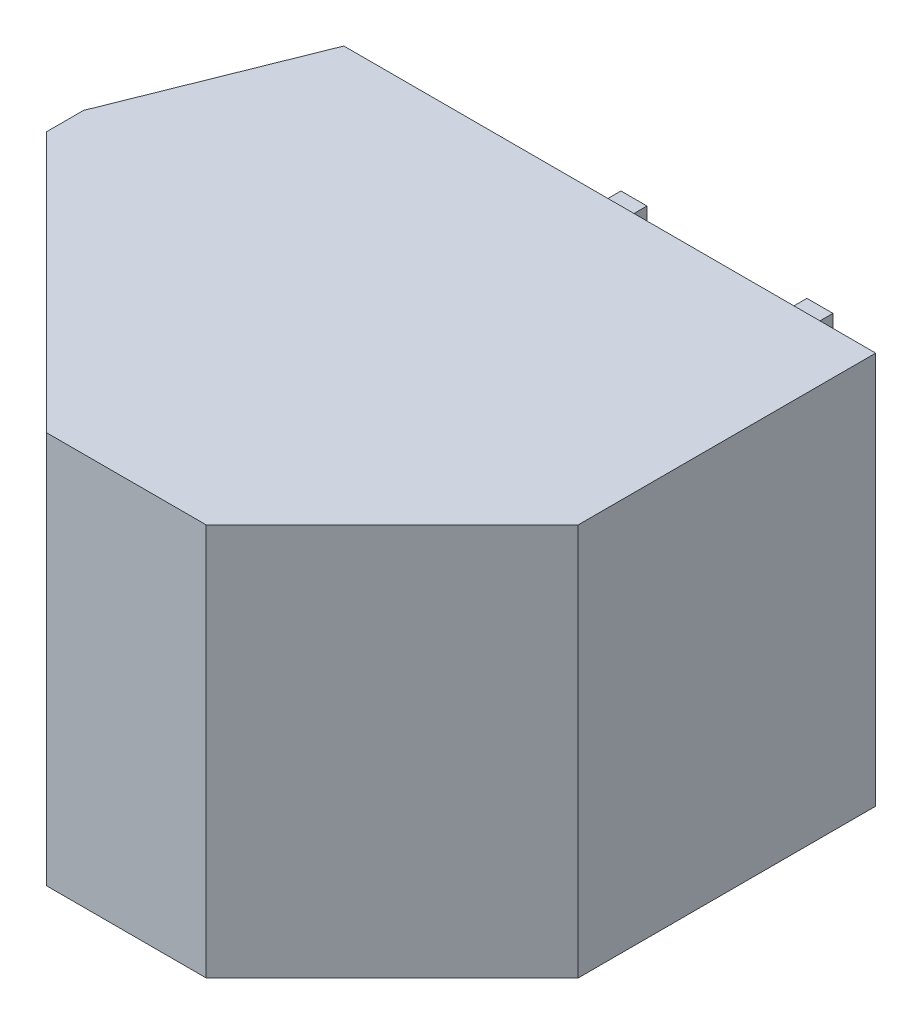
ISO-10303-21;
HEADER;
FILE_DESCRIPTION(('STEP AP214'),'2;1');
FILE_NAME('part.step','',(''),(''),'','','');
FILE_SCHEMA(('AUTOMOTIVE_DESIGN { 1 0 10303 214 1 1 1 1 }'));
ENDSEC;
DATA;
#1=APPLICATION_CONTEXT('core data for automotive mechanical design processes');
#2=APPLICATION_PROTOCOL_DEFINITION('international standard','automotive_design',2000,#1);
#3=PRODUCT_CONTEXT('',#1,'mechanical');
#4=PRODUCT('Part','Part','',(#3));
#5=PRODUCT_RELATED_PRODUCT_CATEGORY('part','',(#4));
#6=PRODUCT_DEFINITION_FORMATION('','',#4);
#7=PRODUCT_DEFINITION_CONTEXT('part definition',#1,'design');
#8=PRODUCT_DEFINITION('design','',#6,#7);
#9=PRODUCT_DEFINITION_SHAPE('','',#8);
#10=(LENGTH_UNIT() NAMED_UNIT(*) SI_UNIT(.MILLI.,.METRE.));
#11=(NAMED_UNIT(*) PLANE_ANGLE_UNIT() SI_UNIT($,.RADIAN.));
#12=(NAMED_UNIT(*) SI_UNIT($,.STERADIAN.) SOLID_ANGLE_UNIT());
#13=UNCERTAINTY_MEASURE_WITH_UNIT(LENGTH_MEASURE(1.E-05),#10,'distance_accuracy_value','');
#14=(GEOMETRIC_REPRESENTATION_CONTEXT(3) GLOBAL_UNCERTAINTY_ASSIGNED_CONTEXT((#13)) GLOBAL_UNIT_ASSIGNED_CONTEXT((#10,
#11,#12)) REPRESENTATION_CONTEXT('',''));
#15=CARTESIAN_POINT('',(0.,0.,0.));
#16=DIRECTION('',(0.,0.,1.));
#17=DIRECTION('',(1.,0.,0.));
#18=AXIS2_PLACEMENT_3D('',#15,#16,#17);
#19=CARTESIAN_POINT('',(0.,0.,0.));
#20=DIRECTION('',(0.,0.,-1.));
#21=DIRECTION('',(-1.,0.,0.));
#22=AXIS2_PLACEMENT_3D('',#19,#20,#21);
#23=PLANE('',#22);
#24=DIRECTION('',(1.,0.,0.));
#25=VECTOR('',#24,1.);
#26=CARTESIAN_POINT('',(0.,0.,0.));
#27=LINE('',#26,#25);
#28=CARTESIAN_POINT('',(2.,0.,0.));
#29=VERTEX_POINT('',#28);
#30=CARTESIAN_POINT('',(16.3,0.,0.));
#31=VERTEX_POINT('',#30);
#32=EDGE_CURVE('E304',#29,#31,#27,.T.);
#33=ORIENTED_EDGE('',*,*,#32,.F.);
#34=DIRECTION('',(0.,1.,0.));
#35=VECTOR('',#34,1.);
#36=CARTESIAN_POINT('',(2.,10.55,0.));
#37=LINE('',#36,#35);
#38=CARTESIAN_POINT('',(2.,10.55,0.));
#39=VERTEX_POINT('',#38);
#40=EDGE_CURVE('E341',#29,#39,#37,.T.);
#41=ORIENTED_EDGE('',*,*,#40,.T.);
#42=DIRECTION('',(-1.,0.,0.));
#43=VECTOR('',#42,1.);
#44=CARTESIAN_POINT('',(0.,10.55,0.));
#45=LINE('',#44,#43);
#46=CARTESIAN_POINT('',(16.3,10.55,0.));
#47=VERTEX_POINT('',#46);
#48=EDGE_CURVE('E308',#47,#39,#45,.T.);
#49=ORIENTED_EDGE('',*,*,#48,.F.);
#50=DIRECTION('',(0.,1.,0.));
#51=VECTOR('',#50,1.);
#52=CARTESIAN_POINT('',(16.3,0.,0.));
#53=LINE('',#52,#51);
#54=EDGE_CURVE('E313',#31,#47,#53,.T.);
#55=ORIENTED_EDGE('',*,*,#54,.F.);
#56=EDGE_LOOP('',(#33,#41,#49,#55));
#57=FACE_BOUND('',#56,.T.);
#58=DIRECTION('',(-1.,0.,0.));
#59=VECTOR('',#58,1.);
#60=CARTESIAN_POINT('',(5.95,1.7,0.));
#61=LINE('',#60,#59);
#62=CARTESIAN_POINT('',(6.65,1.7,0.));
#63=VERTEX_POINT('',#62);
#64=CARTESIAN_POINT('',(5.95,1.7,0.));
#65=VERTEX_POINT('',#64);
#66=EDGE_CURVE('E289',#63,#65,#61,.T.);
#67=ORIENTED_EDGE('',*,*,#66,.F.);
#68=DIRECTION('',(0.,-1.,0.));
#69=VECTOR('',#68,1.);
#70=CARTESIAN_POINT('',(6.65,1.7,0.));
#71=LINE('',#70,#69);
#72=CARTESIAN_POINT('',(6.65,2.4,0.));
#73=VERTEX_POINT('',#72);
#74=EDGE_CURVE('E275',#73,#63,#71,.T.);
#75=ORIENTED_EDGE('',*,*,#74,.F.);
#76=DIRECTION('',(1.,0.,0.));
#77=VECTOR('',#76,1.);
#78=CARTESIAN_POINT('',(5.95,2.4,0.));
#79=LINE('',#78,#77);
#80=CARTESIAN_POINT('',(5.95,2.4,0.));
#81=VERTEX_POINT('',#80);
#82=EDGE_CURVE('E280',#81,#73,#79,.T.);
#83=ORIENTED_EDGE('',*,*,#82,.F.);
#84=DIRECTION('',(0.,1.,0.));
#85=VECTOR('',#84,1.);
#86=CARTESIAN_POINT('',(5.95,1.7,0.));
#87=LINE('',#86,#85);
#88=EDGE_CURVE('E291',#65,#81,#87,.T.);
#89=ORIENTED_EDGE('',*,*,#88,.F.);
#90=EDGE_LOOP('',(#67,#75,#83,#89));
#91=FACE_BOUND('',#90,.T.);
#92=DIRECTION('',(-1.,0.,0.));
#93=VECTOR('',#92,1.);
#94=CARTESIAN_POINT('',(5.95,6.7,0.));
#95=LINE('',#94,#93);
#96=CARTESIAN_POINT('',(6.65,6.7,0.));
#97=VERTEX_POINT('',#96);
#98=CARTESIAN_POINT('',(5.95,6.7,0.));
#99=VERTEX_POINT('',#98);
#100=EDGE_CURVE('E260',#97,#99,#95,.T.);
#101=ORIENTED_EDGE('',*,*,#100,.F.);
#102=DIRECTION('',(0.,-1.,0.));
#103=VECTOR('',#102,1.);
#104=CARTESIAN_POINT('',(6.65,6.7,0.));
#105=LINE('',#104,#103);
#106=CARTESIAN_POINT('',(6.65,7.4,0.));
#107=VERTEX_POINT('',#106);
#108=EDGE_CURVE('E246',#107,#97,#105,.T.);
#109=ORIENTED_EDGE('',*,*,#108,.F.);
#110=DIRECTION('',(1.,0.,0.));
#111=VECTOR('',#110,1.);
#112=CARTESIAN_POINT('',(5.95,7.4,0.));
#113=LINE('',#112,#111);
#114=CARTESIAN_POINT('',(5.95,7.4,0.));
#115=VERTEX_POINT('',#114);
#116=EDGE_CURVE('E251',#115,#107,#113,.T.);
#117=ORIENTED_EDGE('',*,*,#116,.F.);
#118=DIRECTION('',(0.,1.,0.));
#119=VECTOR('',#118,1.);
#120=CARTESIAN_POINT('',(5.95,6.7,0.));
#121=LINE('',#120,#119);
#122=EDGE_CURVE('E262',#99,#115,#121,.T.);
#123=ORIENTED_EDGE('',*,*,#122,.F.);
#124=EDGE_LOOP('',(#101,#109,#117,#123));
#125=FACE_BOUND('',#124,.T.);
#126=DIRECTION('',(-1.,0.,0.));
#127=VECTOR('',#126,1.);
#128=CARTESIAN_POINT('',(10.95,1.7,0.));
#129=LINE('',#128,#127);
#130=CARTESIAN_POINT('',(11.65,1.7,0.));
#131=VERTEX_POINT('',#130);
#132=CARTESIAN_POINT('',(10.95,1.7,0.));
#133=VERTEX_POINT('',#132);
#134=EDGE_CURVE('E218',#131,#133,#129,.T.);
#135=ORIENTED_EDGE('',*,*,#134,.F.);
#136=DIRECTION('',(0.,-1.,0.));
#137=VECTOR('',#136,1.);
#138=CARTESIAN_POINT('',(11.65,1.7,0.));
#139=LINE('',#138,#137);
#140=CARTESIAN_POINT('',(11.65,2.4,0.));
#141=VERTEX_POINT('',#140);
#142=EDGE_CURVE('E215',#141,#131,#139,.T.);
#143=ORIENTED_EDGE('',*,*,#142,.F.);
#144=DIRECTION('',(1.,0.,0.));
#145=VECTOR('',#144,1.);
#146=CARTESIAN_POINT('',(10.95,2.4,0.));
#147=LINE('',#146,#145);
#148=CARTESIAN_POINT('',(10.95,2.4,0.));
#149=VERTEX_POINT('',#148);
#150=EDGE_CURVE('E227',#149,#141,#147,.T.);
#151=ORIENTED_EDGE('',*,*,#150,.F.);
#152=DIRECTION('',(0.,1.,0.));
#153=VECTOR('',#152,1.);
#154=CARTESIAN_POINT('',(10.95,1.7,0.));
#155=LINE('',#154,#153);
#156=EDGE_CURVE('E235',#133,#149,#155,.T.);
#157=ORIENTED_EDGE('',*,*,#156,.F.);
#158=EDGE_LOOP('',(#135,#143,#151,#157));
#159=FACE_BOUND('',#158,.T.);
#160=DIRECTION('',(1.,0.,0.));
#161=VECTOR('',#160,1.);
#162=CARTESIAN_POINT('',(11.65,7.4,0.));
#163=LINE('',#162,#161);
#164=CARTESIAN_POINT('',(10.95,7.4,0.));
#165=VERTEX_POINT('',#164);
#166=CARTESIAN_POINT('',(11.65,7.4,0.));
#167=VERTEX_POINT('',#166);
#168=EDGE_CURVE('E655',#165,#167,#163,.T.);
#169=ORIENTED_EDGE('',*,*,#168,.F.);
#170=DIRECTION('',(0.,1.,0.));
#171=VECTOR('',#170,1.);
#172=CARTESIAN_POINT('',(10.95,7.4,0.));
#173=LINE('',#172,#171);
#174=CARTESIAN_POINT('',(10.95,6.7,0.));
#175=VERTEX_POINT('',#174);
#176=EDGE_CURVE('E213',#175,#165,#173,.T.);
#177=ORIENTED_EDGE('',*,*,#176,.F.);
#178=DIRECTION('',(-1.,0.,0.));
#179=VECTOR('',#178,1.);
#180=CARTESIAN_POINT('',(11.65,6.7,0.));
#181=LINE('',#180,#179);
#182=CARTESIAN_POINT('',(11.65,6.7,0.));
#183=VERTEX_POINT('',#182);
#184=EDGE_CURVE('E209',#183,#175,#181,.T.);
#185=ORIENTED_EDGE('',*,*,#184,.F.);
#186=DIRECTION('',(0.,-1.,0.));
#187=VECTOR('',#186,1.);
#188=CARTESIAN_POINT('',(11.65,7.4,0.));
#189=LINE('',#188,#187);
#190=EDGE_CURVE('E652',#167,#183,#189,.T.);
#191=ORIENTED_EDGE('',*,*,#190,.F.);
#192=EDGE_LOOP('',(#169,#177,#185,#191));
#193=FACE_BOUND('',#192,.T.);
#194=ADVANCED_FACE('F35',(#57,#91,#125,#159,#193),#23,.T.);
#195=CARTESIAN_POINT('',(0.,0.,13.));
#196=DIRECTION('',(1.,0.,0.));
#197=DIRECTION('',(0.,0.,-1.));
#198=AXIS2_PLACEMENT_3D('',#195,#196,#197);
#199=PLANE('',#198);
#200=DIRECTION('',(0.,0.,-1.));
#201=VECTOR('',#200,1.);
#202=CARTESIAN_POINT('',(0.,0.,13.));
#203=LINE('',#202,#201);
#204=CARTESIAN_POINT('',(0.,0.,5.99999999999998));
#205=VERTEX_POINT('',#204);
#206=CARTESIAN_POINT('',(0.,0.,5.00000000000005));
#207=VERTEX_POINT('',#206);
#208=EDGE_CURVE('E324',#205,#207,#203,.T.);
#209=ORIENTED_EDGE('',*,*,#208,.F.);
#210=DIRECTION('',(0.,1.,0.));
#211=VECTOR('',#210,1.);
#212=CARTESIAN_POINT('',(0.,0.,5.99999999999998));
#213=LINE('',#212,#211);
#214=CARTESIAN_POINT('',(0.,10.55,5.99999999999998));
#215=VERTEX_POINT('',#214);
#216=EDGE_CURVE('E43',#205,#215,#213,.T.);
#217=ORIENTED_EDGE('',*,*,#216,.T.);
#218=DIRECTION('',(0.,0.,-1.));
#219=VECTOR('',#218,1.);
#220=CARTESIAN_POINT('',(0.,10.55,13.));
#221=LINE('',#220,#219);
#222=CARTESIAN_POINT('',(0.,10.55,5.00000000000005));
#223=VERTEX_POINT('',#222);
#224=EDGE_CURVE('E311',#215,#223,#221,.T.);
#225=ORIENTED_EDGE('',*,*,#224,.T.);
#226=DIRECTION('',(0.,-1.,0.));
#227=VECTOR('',#226,1.);
#228=CARTESIAN_POINT('',(0.,0.,5.00000000000004));
#229=LINE('',#228,#227);
#230=EDGE_CURVE('E336',#223,#207,#229,.T.);
#231=ORIENTED_EDGE('',*,*,#230,.T.);
#232=EDGE_LOOP('',(#209,#217,#225,#231));
#233=FACE_BOUND('',#232,.T.);
#234=ADVANCED_FACE('F354',(#233),#199,.F.);
#235=CARTESIAN_POINT('',(0.,0.,13.));
#236=DIRECTION('',(0.,1.,0.));
#237=DIRECTION('',(0.,0.,1.));
#238=AXIS2_PLACEMENT_3D('',#235,#236,#237);
#239=PLANE('',#238);
#240=DIRECTION('',(1.,0.,0.));
#241=VECTOR('',#240,1.);
#242=CARTESIAN_POINT('',(0.,0.,13.));
#243=LINE('',#242,#241);
#244=CARTESIAN_POINT('',(7.00000000000002,0.,13.));
#245=VERTEX_POINT('',#244);
#246=CARTESIAN_POINT('',(11.3,0.,13.));
#247=VERTEX_POINT('',#246);
#248=EDGE_CURVE('E305',#245,#247,#243,.T.);
#249=ORIENTED_EDGE('',*,*,#248,.F.);
#250=DIRECTION('',(0.707106781186547,0.,0.707106781186548));
#251=VECTOR('',#250,1.);
#252=CARTESIAN_POINT('',(7.00000000000002,0.,13.));
#253=LINE('',#252,#251);
#254=EDGE_CURVE('E349',#245,#205,#253,.F.);
#255=ORIENTED_EDGE('',*,*,#254,.T.);
#256=ORIENTED_EDGE('',*,*,#208,.T.);
#257=DIRECTION('',(0.371390676354101,0.,-0.92847669088526));
#258=VECTOR('',#257,1.);
#259=CARTESIAN_POINT('',(0.,0.,5.00000000000004));
#260=LINE('',#259,#258);
#261=EDGE_CURVE('E339',#207,#29,#260,.T.);
#262=ORIENTED_EDGE('',*,*,#261,.T.);
#263=ORIENTED_EDGE('',*,*,#32,.T.);
#264=DIRECTION('',(0.,0.,-1.));
#265=VECTOR('',#264,1.);
#266=CARTESIAN_POINT('',(16.3,0.,13.));
#267=LINE('',#266,#265);
#268=CARTESIAN_POINT('',(16.3,0.,7.99999999999998));
#269=VERTEX_POINT('',#268);
#270=EDGE_CURVE('E321',#269,#31,#267,.T.);
#271=ORIENTED_EDGE('',*,*,#270,.F.);
#272=DIRECTION('',(0.707106781186546,0.,-0.707106781186549));
#273=VECTOR('',#272,1.);
#274=CARTESIAN_POINT('',(11.3,0.,13.));
#275=LINE('',#274,#273);
#276=EDGE_CURVE('E333',#269,#247,#275,.F.);
#277=ORIENTED_EDGE('',*,*,#276,.T.);
#278=EDGE_LOOP('',(#249,#255,#256,#262,#263,#271,#277));
#279=FACE_BOUND('',#278,.T.);
#280=ADVANCED_FACE('F367',(#279),#239,.F.);
#281=CARTESIAN_POINT('',(16.3,0.,13.));
#282=DIRECTION('',(-1.,0.,0.));
#283=DIRECTION('',(0.,0.,1.));
#284=AXIS2_PLACEMENT_3D('',#281,#282,#283);
#285=PLANE('',#284);
#286=DIRECTION('',(0.,0.,-1.));
#287=VECTOR('',#286,1.);
#288=CARTESIAN_POINT('',(16.3,10.55,13.));
#289=LINE('',#288,#287);
#290=CARTESIAN_POINT('',(16.3,10.55,7.99999999999998));
#291=VERTEX_POINT('',#290);
#292=EDGE_CURVE('E319',#291,#47,#289,.T.);
#293=ORIENTED_EDGE('',*,*,#292,.F.);
#294=DIRECTION('',(0.,-1.,0.));
#295=VECTOR('',#294,1.);
#296=CARTESIAN_POINT('',(16.3,0.,7.99999999999998));
#297=LINE('',#296,#295);
#298=EDGE_CURVE('E331',#291,#269,#297,.T.);
#299=ORIENTED_EDGE('',*,*,#298,.T.);
#300=ORIENTED_EDGE('',*,*,#270,.T.);
#301=ORIENTED_EDGE('',*,*,#54,.T.);
#302=EDGE_LOOP('',(#293,#299,#300,#301));
#303=FACE_BOUND('',#302,.T.);
#304=ADVANCED_FACE('F376',(#303),#285,.F.);
#305=CARTESIAN_POINT('',(0.,10.55,13.));
#306=DIRECTION('',(0.,-1.,0.));
#307=DIRECTION('',(0.,0.,-1.));
#308=AXIS2_PLACEMENT_3D('',#305,#306,#307);
#309=PLANE('',#308);
#310=ORIENTED_EDGE('',*,*,#224,.F.);
#311=DIRECTION('',(-0.707106781186547,0.,-0.707106781186548));
#312=VECTOR('',#311,1.);
#313=CARTESIAN_POINT('',(7.00000000000002,10.55,13.));
#314=LINE('',#313,#312);
#315=CARTESIAN_POINT('',(7.00000000000002,10.55,13.));
#316=VERTEX_POINT('',#315);
#317=EDGE_CURVE('E11',#215,#316,#314,.F.);
#318=ORIENTED_EDGE('',*,*,#317,.T.);
#319=DIRECTION('',(-1.,0.,0.));
#320=VECTOR('',#319,1.);
#321=CARTESIAN_POINT('',(0.,10.55,13.));
#322=LINE('',#321,#320);
#323=CARTESIAN_POINT('',(11.3,10.55,13.));
#324=VERTEX_POINT('',#323);
#325=EDGE_CURVE('E307',#324,#316,#322,.T.);
#326=ORIENTED_EDGE('',*,*,#325,.F.);
#327=DIRECTION('',(-0.707106781186546,0.,0.707106781186549));
#328=VECTOR('',#327,1.);
#329=CARTESIAN_POINT('',(11.3,10.55,13.));
#330=LINE('',#329,#328);
#331=EDGE_CURVE('E329',#324,#291,#330,.F.);
#332=ORIENTED_EDGE('',*,*,#331,.T.);
#333=ORIENTED_EDGE('',*,*,#292,.T.);
#334=ORIENTED_EDGE('',*,*,#48,.T.);
#335=DIRECTION('',(-0.371390676354101,0.,0.92847669088526));
#336=VECTOR('',#335,1.);
#337=CARTESIAN_POINT('',(0.,10.55,5.00000000000004));
#338=LINE('',#337,#336);
#339=EDGE_CURVE('E343',#39,#223,#338,.T.);
#340=ORIENTED_EDGE('',*,*,#339,.T.);
#341=EDGE_LOOP('',(#310,#318,#326,#332,#333,#334,#340));
#342=FACE_BOUND('',#341,.T.);
#343=ADVANCED_FACE('F358',(#342),#309,.F.);
#344=CARTESIAN_POINT('',(0.,0.,13.));
#345=DIRECTION('',(0.,0.,-1.));
#346=DIRECTION('',(-1.,0.,0.));
#347=AXIS2_PLACEMENT_3D('',#344,#345,#346);
#348=PLANE('',#347);
#349=ORIENTED_EDGE('',*,*,#325,.T.);
#350=DIRECTION('',(0.,-1.,0.));
#351=VECTOR('',#350,1.);
#352=CARTESIAN_POINT('',(7.00000000000002,0.,13.));
#353=LINE('',#352,#351);
#354=EDGE_CURVE('E346',#316,#245,#353,.T.);
#355=ORIENTED_EDGE('',*,*,#354,.T.);
#356=ORIENTED_EDGE('',*,*,#248,.T.);
#357=DIRECTION('',(0.,1.,0.));
#358=VECTOR('',#357,1.);
#359=CARTESIAN_POINT('',(11.3,0.,13.));
#360=LINE('',#359,#358);
#361=EDGE_CURVE('E326',#247,#324,#360,.T.);
#362=ORIENTED_EDGE('',*,*,#361,.T.);
#363=EDGE_LOOP('',(#349,#355,#356,#362));
#364=FACE_BOUND('',#363,.T.);
#365=ADVANCED_FACE('F365',(#364),#348,.F.);
#366=CARTESIAN_POINT('',(11.3,0.,13.));
#367=DIRECTION('',(-0.707106781186549,0.,-0.707106781186546));
#368=DIRECTION('',(0.,1.,0.));
#369=AXIS2_PLACEMENT_3D('',#366,#367,#368);
#370=PLANE('',#369);
#371=ORIENTED_EDGE('',*,*,#276,.F.);
#372=ORIENTED_EDGE('',*,*,#298,.F.);
#373=ORIENTED_EDGE('',*,*,#331,.F.);
#374=ORIENTED_EDGE('',*,*,#361,.F.);
#375=EDGE_LOOP('',(#371,#372,#373,#374));
#376=FACE_BOUND('',#375,.T.);
#377=ADVANCED_FACE('F373',(#376),#370,.F.);
#378=CARTESIAN_POINT('',(0.,0.,5.00000000000004));
#379=DIRECTION('',(-0.92847669088526,0.,-0.371390676354101));
#380=DIRECTION('',(0.,1.,0.));
#381=AXIS2_PLACEMENT_3D('',#378,#379,#380);
#382=PLANE('',#381);
#383=ORIENTED_EDGE('',*,*,#339,.F.);
#384=ORIENTED_EDGE('',*,*,#40,.F.);
#385=ORIENTED_EDGE('',*,*,#261,.F.);
#386=ORIENTED_EDGE('',*,*,#230,.F.);
#387=EDGE_LOOP('',(#383,#384,#385,#386));
#388=FACE_BOUND('',#387,.T.);
#389=ADVANCED_FACE('F384',(#388),#382,.T.);
#390=CARTESIAN_POINT('',(7.00000000000002,0.,13.));
#391=DIRECTION('',(0.707106781186548,0.,-0.707106781186547));
#392=DIRECTION('',(0.,-1.,0.));
#393=AXIS2_PLACEMENT_3D('',#390,#391,#392);
#394=PLANE('',#393);
#395=ORIENTED_EDGE('',*,*,#317,.F.);
#396=ORIENTED_EDGE('',*,*,#216,.F.);
#397=ORIENTED_EDGE('',*,*,#254,.F.);
#398=ORIENTED_EDGE('',*,*,#354,.F.);
#399=EDGE_LOOP('',(#395,#396,#397,#398));
#400=FACE_BOUND('',#399,.T.);
#401=ADVANCED_FACE('F37',(#400),#394,.F.);
#402=CARTESIAN_POINT('',(6.65,1.7,-3.5));
#403=DIRECTION('',(-1.,0.,0.));
#404=DIRECTION('',(0.,0.,1.));
#405=AXIS2_PLACEMENT_3D('',#402,#403,#404);
#406=PLANE('',#405);
#407=ORIENTED_EDGE('',*,*,#74,.T.);
#408=DIRECTION('',(0.,0.,1.));
#409=VECTOR('',#408,1.);
#410=CARTESIAN_POINT('',(6.65,1.7,-3.5));
#411=LINE('',#410,#409);
#412=CARTESIAN_POINT('',(6.65,1.7,-3.5));
#413=VERTEX_POINT('',#412);
#414=EDGE_CURVE('E302',#413,#63,#411,.T.);
#415=ORIENTED_EDGE('',*,*,#414,.F.);
#416=DIRECTION('',(0.,-1.,0.));
#417=VECTOR('',#416,1.);
#418=CARTESIAN_POINT('',(6.65,1.7,-3.5));
#419=LINE('',#418,#417);
#420=CARTESIAN_POINT('',(6.65,2.4,-3.5));
#421=VERTEX_POINT('',#420);
#422=EDGE_CURVE('E276',#421,#413,#419,.T.);
#423=ORIENTED_EDGE('',*,*,#422,.F.);
#424=DIRECTION('',(0.,0.,1.));
#425=VECTOR('',#424,1.);
#426=CARTESIAN_POINT('',(6.65,2.4,-3.5));
#427=LINE('',#426,#425);
#428=EDGE_CURVE('E286',#421,#73,#427,.T.);
#429=ORIENTED_EDGE('',*,*,#428,.T.);
#430=EDGE_LOOP('',(#407,#415,#423,#429));
#431=FACE_BOUND('',#430,.T.);
#432=ADVANCED_FACE('F391',(#431),#406,.F.);
#433=CARTESIAN_POINT('',(5.95,1.7,-3.5));
#434=DIRECTION('',(0.,1.,0.));
#435=DIRECTION('',(-1.,0.,0.));
#436=AXIS2_PLACEMENT_3D('',#433,#434,#435);
#437=PLANE('',#436);
#438=ORIENTED_EDGE('',*,*,#66,.T.);
#439=DIRECTION('',(0.,0.,1.));
#440=VECTOR('',#439,1.);
#441=CARTESIAN_POINT('',(5.95,1.7,-3.5));
#442=LINE('',#441,#440);
#443=CARTESIAN_POINT('',(5.95,1.7,-3.5));
#444=VERTEX_POINT('',#443);
#445=EDGE_CURVE('E299',#444,#65,#442,.T.);
#446=ORIENTED_EDGE('',*,*,#445,.F.);
#447=DIRECTION('',(-1.,0.,0.));
#448=VECTOR('',#447,1.);
#449=CARTESIAN_POINT('',(5.95,1.7,-3.5));
#450=LINE('',#449,#448);
#451=EDGE_CURVE('E279',#413,#444,#450,.T.);
#452=ORIENTED_EDGE('',*,*,#451,.F.);
#453=ORIENTED_EDGE('',*,*,#414,.T.);
#454=EDGE_LOOP('',(#438,#446,#452,#453));
#455=FACE_BOUND('',#454,.T.);
#456=ADVANCED_FACE('F463',(#455),#437,.F.);
#457=CARTESIAN_POINT('',(5.95,1.7,-3.5));
#458=DIRECTION('',(1.,0.,0.));
#459=DIRECTION('',(0.,0.,-1.));
#460=AXIS2_PLACEMENT_3D('',#457,#458,#459);
#461=PLANE('',#460);
#462=ORIENTED_EDGE('',*,*,#88,.T.);
#463=DIRECTION('',(0.,0.,1.));
#464=VECTOR('',#463,1.);
#465=CARTESIAN_POINT('',(5.95,2.4,-3.5));
#466=LINE('',#465,#464);
#467=CARTESIAN_POINT('',(5.95,2.4,-3.5));
#468=VERTEX_POINT('',#467);
#469=EDGE_CURVE('E297',#468,#81,#466,.T.);
#470=ORIENTED_EDGE('',*,*,#469,.F.);
#471=DIRECTION('',(0.,1.,0.));
#472=VECTOR('',#471,1.);
#473=CARTESIAN_POINT('',(5.95,1.7,-3.5));
#474=LINE('',#473,#472);
#475=EDGE_CURVE('E282',#444,#468,#474,.T.);
#476=ORIENTED_EDGE('',*,*,#475,.F.);
#477=ORIENTED_EDGE('',*,*,#445,.T.);
#478=EDGE_LOOP('',(#462,#470,#476,#477));
#479=FACE_BOUND('',#478,.T.);
#480=ADVANCED_FACE('F471',(#479),#461,.F.);
#481=CARTESIAN_POINT('',(5.95,2.4,-3.5));
#482=DIRECTION('',(0.,-1.,0.));
#483=DIRECTION('',(0.,0.,-1.));
#484=AXIS2_PLACEMENT_3D('',#481,#482,#483);
#485=PLANE('',#484);
#486=ORIENTED_EDGE('',*,*,#82,.T.);
#487=ORIENTED_EDGE('',*,*,#428,.F.);
#488=DIRECTION('',(1.,0.,0.));
#489=VECTOR('',#488,1.);
#490=CARTESIAN_POINT('',(5.95,2.4,-3.5));
#491=LINE('',#490,#489);
#492=EDGE_CURVE('E284',#468,#421,#491,.T.);
#493=ORIENTED_EDGE('',*,*,#492,.F.);
#494=ORIENTED_EDGE('',*,*,#469,.T.);
#495=EDGE_LOOP('',(#486,#487,#493,#494));
#496=FACE_BOUND('',#495,.T.);
#497=ADVANCED_FACE('F480',(#496),#485,.F.);
#498=CARTESIAN_POINT('',(0.,0.,-3.5));
#499=DIRECTION('',(0.,0.,-1.));
#500=DIRECTION('',(-1.,0.,0.));
#501=AXIS2_PLACEMENT_3D('',#498,#499,#500);
#502=PLANE('',#501);
#503=ORIENTED_EDGE('',*,*,#422,.T.);
#504=ORIENTED_EDGE('',*,*,#451,.T.);
#505=ORIENTED_EDGE('',*,*,#475,.T.);
#506=ORIENTED_EDGE('',*,*,#492,.T.);
#507=EDGE_LOOP('',(#503,#504,#505,#506));
#508=FACE_BOUND('',#507,.T.);
#509=ADVANCED_FACE('F489',(#508),#502,.T.);
#510=CARTESIAN_POINT('',(6.65,6.7,-3.5));
#511=DIRECTION('',(-1.,0.,0.));
#512=DIRECTION('',(0.,0.,1.));
#513=AXIS2_PLACEMENT_3D('',#510,#511,#512);
#514=PLANE('',#513);
#515=ORIENTED_EDGE('',*,*,#108,.T.);
#516=DIRECTION('',(0.,0.,1.));
#517=VECTOR('',#516,1.);
#518=CARTESIAN_POINT('',(6.65,6.7,-3.5));
#519=LINE('',#518,#517);
#520=CARTESIAN_POINT('',(6.65,6.7,-3.5));
#521=VERTEX_POINT('',#520);
#522=EDGE_CURVE('E273',#521,#97,#519,.T.);
#523=ORIENTED_EDGE('',*,*,#522,.F.);
#524=DIRECTION('',(0.,-1.,0.));
#525=VECTOR('',#524,1.);
#526=CARTESIAN_POINT('',(6.65,6.7,-3.5));
#527=LINE('',#526,#525);
#528=CARTESIAN_POINT('',(6.65,7.4,-3.5));
#529=VERTEX_POINT('',#528);
#530=EDGE_CURVE('E247',#529,#521,#527,.T.);
#531=ORIENTED_EDGE('',*,*,#530,.F.);
#532=DIRECTION('',(0.,0.,1.));
#533=VECTOR('',#532,1.);
#534=CARTESIAN_POINT('',(6.65,7.4,-3.5));
#535=LINE('',#534,#533);
#536=EDGE_CURVE('E257',#529,#107,#535,.T.);
#537=ORIENTED_EDGE('',*,*,#536,.T.);
#538=EDGE_LOOP('',(#515,#523,#531,#537));
#539=FACE_BOUND('',#538,.T.);
#540=ADVANCED_FACE('F498',(#539),#514,.F.);
#541=CARTESIAN_POINT('',(5.95,6.7,-3.5));
#542=DIRECTION('',(0.,1.,0.));
#543=DIRECTION('',(0.,0.,1.));
#544=AXIS2_PLACEMENT_3D('',#541,#542,#543);
#545=PLANE('',#544);
#546=ORIENTED_EDGE('',*,*,#100,.T.);
#547=DIRECTION('',(0.,0.,1.));
#548=VECTOR('',#547,1.);
#549=CARTESIAN_POINT('',(5.95,6.7,-3.5));
#550=LINE('',#549,#548);
#551=CARTESIAN_POINT('',(5.95,6.7,-3.5));
#552=VERTEX_POINT('',#551);
#553=EDGE_CURVE('E270',#552,#99,#550,.T.);
#554=ORIENTED_EDGE('',*,*,#553,.F.);
#555=DIRECTION('',(-1.,0.,0.));
#556=VECTOR('',#555,1.);
#557=CARTESIAN_POINT('',(5.95,6.7,-3.5));
#558=LINE('',#557,#556);
#559=EDGE_CURVE('E250',#521,#552,#558,.T.);
#560=ORIENTED_EDGE('',*,*,#559,.F.);
#561=ORIENTED_EDGE('',*,*,#522,.T.);
#562=EDGE_LOOP('',(#546,#554,#560,#561));
#563=FACE_BOUND('',#562,.T.);
#564=ADVANCED_FACE('F507',(#563),#545,.F.);
#565=CARTESIAN_POINT('',(5.95,6.7,-3.5));
#566=DIRECTION('',(1.,0.,0.));
#567=DIRECTION('',(0.,0.,-1.));
#568=AXIS2_PLACEMENT_3D('',#565,#566,#567);
#569=PLANE('',#568);
#570=ORIENTED_EDGE('',*,*,#122,.T.);
#571=DIRECTION('',(0.,0.,1.));
#572=VECTOR('',#571,1.);
#573=CARTESIAN_POINT('',(5.95,7.4,-3.5));
#574=LINE('',#573,#572);
#575=CARTESIAN_POINT('',(5.95,7.4,-3.5));
#576=VERTEX_POINT('',#575);
#577=EDGE_CURVE('E268',#576,#115,#574,.T.);
#578=ORIENTED_EDGE('',*,*,#577,.F.);
#579=DIRECTION('',(0.,1.,0.));
#580=VECTOR('',#579,1.);
#581=CARTESIAN_POINT('',(5.95,6.7,-3.5));
#582=LINE('',#581,#580);
#583=EDGE_CURVE('E253',#552,#576,#582,.T.);
#584=ORIENTED_EDGE('',*,*,#583,.F.);
#585=ORIENTED_EDGE('',*,*,#553,.T.);
#586=EDGE_LOOP('',(#570,#578,#584,#585));
#587=FACE_BOUND('',#586,.T.);
#588=ADVANCED_FACE('F516',(#587),#569,.F.);
#589=CARTESIAN_POINT('',(5.95,7.4,-3.5));
#590=DIRECTION('',(0.,-1.,0.));
#591=DIRECTION('',(0.,0.,-1.));
#592=AXIS2_PLACEMENT_3D('',#589,#590,#591);
#593=PLANE('',#592);
#594=ORIENTED_EDGE('',*,*,#116,.T.);
#595=ORIENTED_EDGE('',*,*,#536,.F.);
#596=DIRECTION('',(1.,0.,0.));
#597=VECTOR('',#596,1.);
#598=CARTESIAN_POINT('',(5.95,7.4,-3.5));
#599=LINE('',#598,#597);
#600=EDGE_CURVE('E255',#576,#529,#599,.T.);
#601=ORIENTED_EDGE('',*,*,#600,.F.);
#602=ORIENTED_EDGE('',*,*,#577,.T.);
#603=EDGE_LOOP('',(#594,#595,#601,#602));
#604=FACE_BOUND('',#603,.T.);
#605=ADVANCED_FACE('F525',(#604),#593,.F.);
#606=CARTESIAN_POINT('',(0.,0.,-3.5));
#607=DIRECTION('',(0.,0.,-1.));
#608=DIRECTION('',(-1.,0.,0.));
#609=AXIS2_PLACEMENT_3D('',#606,#607,#608);
#610=PLANE('',#609);
#611=ORIENTED_EDGE('',*,*,#530,.T.);
#612=ORIENTED_EDGE('',*,*,#559,.T.);
#613=ORIENTED_EDGE('',*,*,#583,.T.);
#614=ORIENTED_EDGE('',*,*,#600,.T.);
#615=EDGE_LOOP('',(#611,#612,#613,#614));
#616=FACE_BOUND('',#615,.T.);
#617=ADVANCED_FACE('F534',(#616),#610,.T.);
#618=CARTESIAN_POINT('',(11.65,1.7,-3.5));
#619=DIRECTION('',(-1.,0.,0.));
#620=DIRECTION('',(0.,0.,1.));
#621=AXIS2_PLACEMENT_3D('',#618,#619,#620);
#622=PLANE('',#621);
#623=ORIENTED_EDGE('',*,*,#142,.T.);
#624=DIRECTION('',(0.,0.,1.));
#625=VECTOR('',#624,1.);
#626=CARTESIAN_POINT('',(11.65,1.7,-3.5));
#627=LINE('',#626,#625);
#628=CARTESIAN_POINT('',(11.65,1.7,-3.5));
#629=VERTEX_POINT('',#628);
#630=EDGE_CURVE('E244',#629,#131,#627,.T.);
#631=ORIENTED_EDGE('',*,*,#630,.F.);
#632=DIRECTION('',(0.,-1.,0.));
#633=VECTOR('',#632,1.);
#634=CARTESIAN_POINT('',(11.65,1.7,-3.5));
#635=LINE('',#634,#633);
#636=CARTESIAN_POINT('',(11.65,2.4,-3.5));
#637=VERTEX_POINT('',#636);
#638=EDGE_CURVE('E223',#637,#629,#635,.T.);
#639=ORIENTED_EDGE('',*,*,#638,.F.);
#640=DIRECTION('',(0.,0.,1.));
#641=VECTOR('',#640,1.);
#642=CARTESIAN_POINT('',(11.65,2.4,-3.5));
#643=LINE('',#642,#641);
#644=EDGE_CURVE('E232',#637,#141,#643,.T.);
#645=ORIENTED_EDGE('',*,*,#644,.T.);
#646=EDGE_LOOP('',(#623,#631,#639,#645));
#647=FACE_BOUND('',#646,.T.);
#648=ADVANCED_FACE('F543',(#647),#622,.F.);
#649=CARTESIAN_POINT('',(10.95,1.7,-3.5));
#650=DIRECTION('',(0.,1.,0.));
#651=DIRECTION('',(0.,0.,1.));
#652=AXIS2_PLACEMENT_3D('',#649,#650,#651);
#653=PLANE('',#652);
#654=ORIENTED_EDGE('',*,*,#134,.T.);
#655=DIRECTION('',(0.,0.,1.));
#656=VECTOR('',#655,1.);
#657=CARTESIAN_POINT('',(10.95,1.7,-3.5));
#658=LINE('',#657,#656);
#659=CARTESIAN_POINT('',(10.95,1.7,-3.5));
#660=VERTEX_POINT('',#659);
#661=EDGE_CURVE('E241',#660,#133,#658,.T.);
#662=ORIENTED_EDGE('',*,*,#661,.F.);
#663=DIRECTION('',(-1.,0.,0.));
#664=VECTOR('',#663,1.);
#665=CARTESIAN_POINT('',(10.95,1.7,-3.5));
#666=LINE('',#665,#664);
#667=EDGE_CURVE('E226',#629,#660,#666,.T.);
#668=ORIENTED_EDGE('',*,*,#667,.F.);
#669=ORIENTED_EDGE('',*,*,#630,.T.);
#670=EDGE_LOOP('',(#654,#662,#668,#669));
#671=FACE_BOUND('',#670,.T.);
#672=ADVANCED_FACE('F552',(#671),#653,.F.);
#673=CARTESIAN_POINT('',(10.95,1.7,-3.5));
#674=DIRECTION('',(1.,0.,0.));
#675=DIRECTION('',(0.,0.,-1.));
#676=AXIS2_PLACEMENT_3D('',#673,#674,#675);
#677=PLANE('',#676);
#678=ORIENTED_EDGE('',*,*,#156,.T.);
#679=DIRECTION('',(0.,0.,1.));
#680=VECTOR('',#679,1.);
#681=CARTESIAN_POINT('',(10.95,2.4,-3.5));
#682=LINE('',#681,#680);
#683=CARTESIAN_POINT('',(10.95,2.4,-3.5));
#684=VERTEX_POINT('',#683);
#685=EDGE_CURVE('E58',#684,#149,#682,.T.);
#686=ORIENTED_EDGE('',*,*,#685,.F.);
#687=DIRECTION('',(0.,1.,0.));
#688=VECTOR('',#687,1.);
#689=CARTESIAN_POINT('',(10.95,1.7,-3.5));
#690=LINE('',#689,#688);
#691=EDGE_CURVE('E229',#660,#684,#690,.T.);
#692=ORIENTED_EDGE('',*,*,#691,.F.);
#693=ORIENTED_EDGE('',*,*,#661,.T.);
#694=EDGE_LOOP('',(#678,#686,#692,#693));
#695=FACE_BOUND('',#694,.T.);
#696=ADVANCED_FACE('F561',(#695),#677,.F.);
#697=CARTESIAN_POINT('',(10.95,2.4,-3.5));
#698=DIRECTION('',(0.,-1.,0.));
#699=DIRECTION('',(0.,0.,-1.));
#700=AXIS2_PLACEMENT_3D('',#697,#698,#699);
#701=PLANE('',#700);
#702=ORIENTED_EDGE('',*,*,#150,.T.);
#703=ORIENTED_EDGE('',*,*,#644,.F.);
#704=DIRECTION('',(1.,0.,0.));
#705=VECTOR('',#704,1.);
#706=CARTESIAN_POINT('',(10.95,2.4,-3.5));
#707=LINE('',#706,#705);
#708=EDGE_CURVE('E231',#684,#637,#707,.T.);
#709=ORIENTED_EDGE('',*,*,#708,.F.);
#710=ORIENTED_EDGE('',*,*,#685,.T.);
#711=EDGE_LOOP('',(#702,#703,#709,#710));
#712=FACE_BOUND('',#711,.T.);
#713=ADVANCED_FACE('F570',(#712),#701,.F.);
#714=CARTESIAN_POINT('',(0.,0.,-3.5));
#715=DIRECTION('',(0.,0.,-1.));
#716=DIRECTION('',(-1.,0.,0.));
#717=AXIS2_PLACEMENT_3D('',#714,#715,#716);
#718=PLANE('',#717);
#719=ORIENTED_EDGE('',*,*,#638,.T.);
#720=ORIENTED_EDGE('',*,*,#667,.T.);
#721=ORIENTED_EDGE('',*,*,#691,.T.);
#722=ORIENTED_EDGE('',*,*,#708,.T.);
#723=EDGE_LOOP('',(#719,#720,#721,#722));
#724=FACE_BOUND('',#723,.T.);
#725=ADVANCED_FACE('F579',(#724),#718,.T.);
#726=CARTESIAN_POINT('',(10.95,7.4,-3.5));
#727=DIRECTION('',(1.,0.,0.));
#728=DIRECTION('',(0.,0.,-1.));
#729=AXIS2_PLACEMENT_3D('',#726,#727,#728);
#730=PLANE('',#729);
#731=ORIENTED_EDGE('',*,*,#176,.T.);
#732=DIRECTION('',(0.,0.,1.));
#733=VECTOR('',#732,1.);
#734=CARTESIAN_POINT('',(10.95,7.4,-3.5));
#735=LINE('',#734,#733);
#736=CARTESIAN_POINT('',(10.95,7.4,-3.5));
#737=VERTEX_POINT('',#736);
#738=EDGE_CURVE('E194',#737,#165,#735,.T.);
#739=ORIENTED_EDGE('',*,*,#738,.F.);
#740=DIRECTION('',(0.,1.,0.));
#741=VECTOR('',#740,1.);
#742=CARTESIAN_POINT('',(10.95,7.4,-3.5));
#743=LINE('',#742,#741);
#744=CARTESIAN_POINT('',(10.95,6.7,-3.5));
#745=VERTEX_POINT('',#744);
#746=EDGE_CURVE('E201',#745,#737,#743,.T.);
#747=ORIENTED_EDGE('',*,*,#746,.F.);
#748=DIRECTION('',(0.,0.,1.));
#749=VECTOR('',#748,1.);
#750=CARTESIAN_POINT('',(10.95,6.7,-3.5));
#751=LINE('',#750,#749);
#752=EDGE_CURVE('E649',#745,#175,#751,.T.);
#753=ORIENTED_EDGE('',*,*,#752,.T.);
#754=EDGE_LOOP('',(#731,#739,#747,#753));
#755=FACE_BOUND('',#754,.T.);
#756=ADVANCED_FACE('F211',(#755),#730,.F.);
#757=CARTESIAN_POINT('',(11.65,7.4,-3.5));
#758=DIRECTION('',(0.,-1.,0.));
#759=DIRECTION('',(0.,0.,-1.));
#760=AXIS2_PLACEMENT_3D('',#757,#758,#759);
#761=PLANE('',#760);
#762=ORIENTED_EDGE('',*,*,#168,.T.);
#763=DIRECTION('',(0.,0.,1.));
#764=VECTOR('',#763,1.);
#765=CARTESIAN_POINT('',(11.65,7.4,-3.5));
#766=LINE('',#765,#764);
#767=CARTESIAN_POINT('',(11.65,7.4,-3.5));
#768=VERTEX_POINT('',#767);
#769=EDGE_CURVE('E197',#768,#167,#766,.T.);
#770=ORIENTED_EDGE('',*,*,#769,.F.);
#771=DIRECTION('',(1.,0.,0.));
#772=VECTOR('',#771,1.);
#773=CARTESIAN_POINT('',(11.65,7.4,-3.5));
#774=LINE('',#773,#772);
#775=EDGE_CURVE('E190',#737,#768,#774,.T.);
#776=ORIENTED_EDGE('',*,*,#775,.F.);
#777=ORIENTED_EDGE('',*,*,#738,.T.);
#778=EDGE_LOOP('',(#762,#770,#776,#777));
#779=FACE_BOUND('',#778,.T.);
#780=ADVANCED_FACE('F192',(#779),#761,.F.);
#781=CARTESIAN_POINT('',(11.65,7.4,-3.5));
#782=DIRECTION('',(-1.,0.,0.));
#783=DIRECTION('',(0.,0.,1.));
#784=AXIS2_PLACEMENT_3D('',#781,#782,#783);
#785=PLANE('',#784);
#786=ORIENTED_EDGE('',*,*,#190,.T.);
#787=DIRECTION('',(0.,0.,1.));
#788=VECTOR('',#787,1.);
#789=CARTESIAN_POINT('',(11.65,6.7,-3.5));
#790=LINE('',#789,#788);
#791=CARTESIAN_POINT('',(11.65,6.7,-3.5));
#792=VERTEX_POINT('',#791);
#793=EDGE_CURVE('E50',#792,#183,#790,.T.);
#794=ORIENTED_EDGE('',*,*,#793,.F.);
#795=DIRECTION('',(0.,-1.,0.));
#796=VECTOR('',#795,1.);
#797=CARTESIAN_POINT('',(11.65,7.4,-3.5));
#798=LINE('',#797,#796);
#799=EDGE_CURVE('E200',#768,#792,#798,.T.);
#800=ORIENTED_EDGE('',*,*,#799,.F.);
#801=ORIENTED_EDGE('',*,*,#769,.T.);
#802=EDGE_LOOP('',(#786,#794,#800,#801));
#803=FACE_BOUND('',#802,.T.);
#804=ADVANCED_FACE('F602',(#803),#785,.F.);
#805=CARTESIAN_POINT('',(11.65,6.7,-3.5));
#806=DIRECTION('',(0.,1.,0.));
#807=DIRECTION('',(0.,0.,1.));
#808=AXIS2_PLACEMENT_3D('',#805,#806,#807);
#809=PLANE('',#808);
#810=ORIENTED_EDGE('',*,*,#184,.T.);
#811=ORIENTED_EDGE('',*,*,#752,.F.);
#812=DIRECTION('',(-1.,0.,0.));
#813=VECTOR('',#812,1.);
#814=CARTESIAN_POINT('',(11.65,6.7,-3.5));
#815=LINE('',#814,#813);
#816=EDGE_CURVE('E205',#792,#745,#815,.T.);
#817=ORIENTED_EDGE('',*,*,#816,.F.);
#818=ORIENTED_EDGE('',*,*,#793,.T.);
#819=EDGE_LOOP('',(#810,#811,#817,#818));
#820=FACE_BOUND('',#819,.T.);
#821=ADVANCED_FACE('F610',(#820),#809,.F.);
#822=CARTESIAN_POINT('',(0.,0.,-3.5));
#823=DIRECTION('',(0.,0.,-1.));
#824=DIRECTION('',(-1.,0.,0.));
#825=AXIS2_PLACEMENT_3D('',#822,#823,#824);
#826=PLANE('',#825);
#827=ORIENTED_EDGE('',*,*,#746,.T.);
#828=ORIENTED_EDGE('',*,*,#775,.T.);
#829=ORIENTED_EDGE('',*,*,#799,.T.);
#830=ORIENTED_EDGE('',*,*,#816,.T.);
#831=EDGE_LOOP('',(#827,#828,#829,#830));
#832=FACE_BOUND('',#831,.T.);
#833=ADVANCED_FACE('F204',(#832),#826,.T.);
#834=CLOSED_SHELL('',(#194,#234,#280,#304,#343,#365,#377,#389,#401,#432,#456,#480,#497,#509,
#540,#564,#588,#605,#617,#648,#672,#696,#713,#725,#756,#780,#804,#821,#833));
#835=MANIFOLD_SOLID_BREP('B2',#834);
#836=ADVANCED_BREP_SHAPE_REPRESENTATION('',(#18,#835),#14);
#837=SHAPE_DEFINITION_REPRESENTATION(#9,#836);
ENDSEC;
END-ISO-10303-21;
